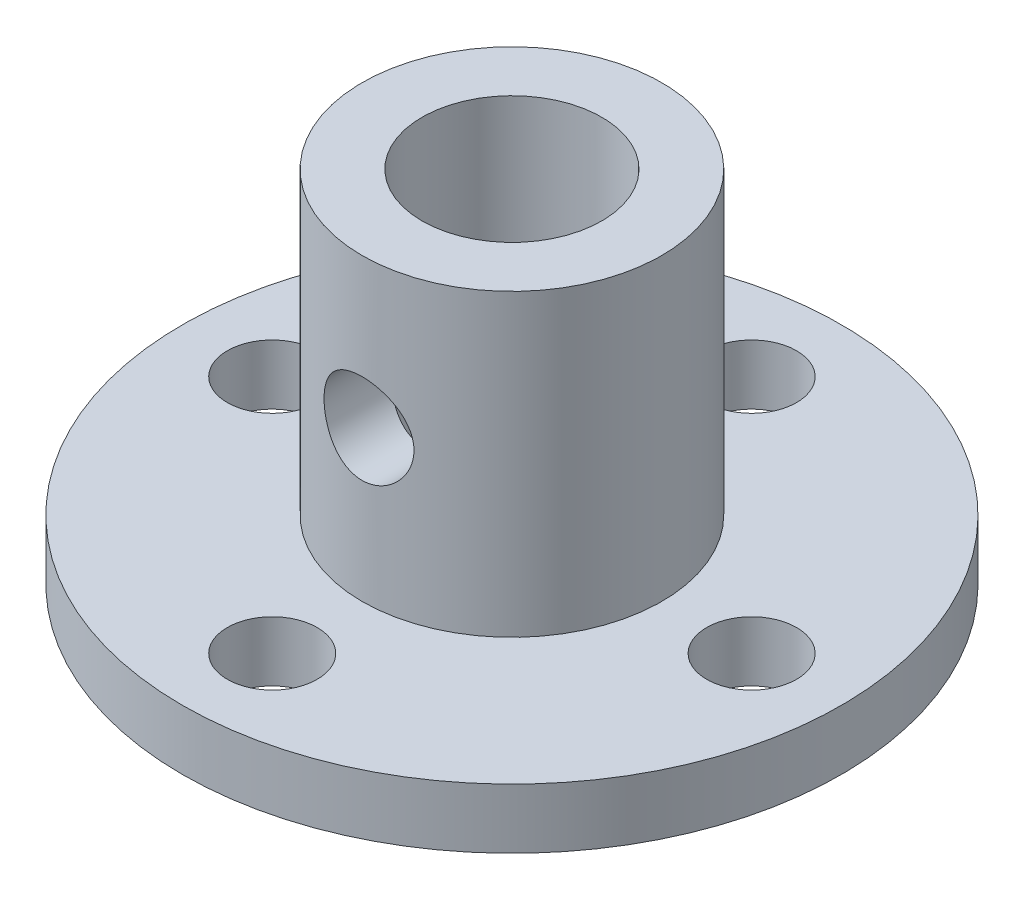
ISO-10303-21;
HEADER;
FILE_DESCRIPTION(('STEP AP214'),'2;1');
FILE_NAME('part.step','',(''),(''),'','','');
FILE_SCHEMA(('AUTOMOTIVE_DESIGN { 1 0 10303 214 1 1 1 1 }'));
ENDSEC;
DATA;
#1=APPLICATION_CONTEXT('core data for automotive mechanical design processes');
#2=APPLICATION_PROTOCOL_DEFINITION('international standard','automotive_design',2000,#1);
#3=PRODUCT_CONTEXT('',#1,'mechanical');
#4=PRODUCT('Part','Part','',(#3));
#5=PRODUCT_RELATED_PRODUCT_CATEGORY('part','',(#4));
#6=PRODUCT_DEFINITION_FORMATION('','',#4);
#7=PRODUCT_DEFINITION_CONTEXT('part definition',#1,'design');
#8=PRODUCT_DEFINITION('design','',#6,#7);
#9=PRODUCT_DEFINITION_SHAPE('','',#8);
#10=(LENGTH_UNIT() NAMED_UNIT(*) SI_UNIT(.MILLI.,.METRE.));
#11=(NAMED_UNIT(*) PLANE_ANGLE_UNIT() SI_UNIT($,.RADIAN.));
#12=(NAMED_UNIT(*) SI_UNIT($,.STERADIAN.) SOLID_ANGLE_UNIT());
#13=UNCERTAINTY_MEASURE_WITH_UNIT(LENGTH_MEASURE(1.E-05),#10,'distance_accuracy_value','');
#14=(GEOMETRIC_REPRESENTATION_CONTEXT(3) GLOBAL_UNCERTAINTY_ASSIGNED_CONTEXT((#13)) GLOBAL_UNIT_ASSIGNED_CONTEXT((#10,
#11,#12)) REPRESENTATION_CONTEXT('',''));
#15=CARTESIAN_POINT('',(0.,0.,0.));
#16=DIRECTION('',(0.,0.,1.));
#17=DIRECTION('',(1.,0.,0.));
#18=AXIS2_PLACEMENT_3D('',#15,#16,#17);
#19=CARTESIAN_POINT('',(0.,12.,0.));
#20=DIRECTION('',(0.,-1.,0.));
#21=DIRECTION('',(0.,0.,-1.));
#22=AXIS2_PLACEMENT_3D('',#19,#20,#21);
#23=CYLINDRICAL_SURFACE('',#22,5.);
#24=CARTESIAN_POINT('',(0.,12.,0.));
#25=DIRECTION('',(0.,1.,0.));
#26=DIRECTION('',(0.,0.,1.));
#27=AXIS2_PLACEMENT_3D('',#24,#25,#26);
#28=CIRCLE('',#27,5.);
#29=CARTESIAN_POINT('',(0.,12.,5.));
#30=VERTEX_POINT('',#29);
#31=EDGE_CURVE('E59',#30,#30,#28,.T.);
#32=ORIENTED_EDGE('',*,*,#31,.F.);
#33=EDGE_LOOP('',(#32));
#34=FACE_BOUND('',#33,.T.);
#35=CARTESIAN_POINT('',(0.,2.,0.));
#36=DIRECTION('',(0.,1.,0.));
#37=DIRECTION('',(0.,0.,1.));
#38=AXIS2_PLACEMENT_3D('',#35,#36,#37);
#39=CIRCLE('',#38,5.);
#40=CARTESIAN_POINT('',(0.,2.,5.));
#41=VERTEX_POINT('',#40);
#42=EDGE_CURVE('E10',#41,#41,#39,.T.);
#43=ORIENTED_EDGE('',*,*,#42,.T.);
#44=EDGE_LOOP('',(#43));
#45=FACE_BOUND('',#44,.T.);
#46=CARTESIAN_POINT('',(0.,8.5,-5.));
#47=CARTESIAN_POINT('',(0.0822886127532999,8.49999900251511,-4.9999992925055));
#48=CARTESIAN_POINT('',(0.164587318351529,8.49320613637603,-4.99794915693954));
#49=CARTESIAN_POINT('',(0.326788125304881,8.4662786457779,-4.98997105593691));
#50=CARTESIAN_POINT('',(0.40668950441142,8.44614004197666,-4.98404193389692));
#51=CARTESIAN_POINT('',(0.561732707754527,8.39325398308974,-4.96895552501836));
#52=CARTESIAN_POINT('',(0.636881364395373,8.36052513038107,-4.95980300250425));
#53=CARTESIAN_POINT('',(0.780624181053132,8.28346390694417,-4.93922109237645));
#54=CARTESIAN_POINT('',(0.84921746746967,8.23912999260458,-4.92779140192067));
#55=CARTESIAN_POINT('',(0.979871797183745,8.13877599252733,-4.90350737192774));
#56=CARTESIAN_POINT('',(1.04171807124434,8.08248337411409,-4.89062383657036));
#57=CARTESIAN_POINT('',(1.15524920923324,7.96039077008982,-4.86505834210442));
#58=CARTESIAN_POINT('',(1.20693236327441,7.89458918787504,-4.85237641724501));
#59=CARTESIAN_POINT('',(1.29980037723708,7.75352924696239,-4.82834113993772));
#60=CARTESIAN_POINT('',(1.34072309022213,7.67809153900926,-4.81702406663875));
#61=CARTESIAN_POINT('',(1.4092139477476,7.52101074576971,-4.79743620394031));
#62=CARTESIAN_POINT('',(1.43678529919973,7.43936915607202,-4.78916468313311));
#63=CARTESIAN_POINT('',(1.47701633682652,7.27460973386954,-4.77690870838434));
#64=CARTESIAN_POINT('',(1.49007196234677,7.19159725613606,-4.77281069324533));
#65=CARTESIAN_POINT('',(1.50213730614672,7.02446684378323,-4.76902789749767));
#66=CARTESIAN_POINT('',(1.50115042761078,6.94034918194091,-4.76934204760571));
#67=CARTESIAN_POINT('',(1.48546977199812,6.77661609139152,-4.77424744067778));
#68=CARTESIAN_POINT('',(1.47127205262685,6.69694774963776,-4.7786838859914));
#69=CARTESIAN_POINT('',(1.43037420427056,6.54118021372654,-4.79108356228624));
#70=CARTESIAN_POINT('',(1.40367284141641,6.46508137262567,-4.79904714132351));
#71=CARTESIAN_POINT('',(1.33816026653682,6.31739965033926,-4.81772733074973));
#72=CARTESIAN_POINT('',(1.29918816934642,6.24589291604474,-4.82848016115952));
#73=CARTESIAN_POINT('',(1.21035222588683,6.11026797798981,-4.85150987000065));
#74=CARTESIAN_POINT('',(1.16048574002588,6.04615157058622,-4.86378711746991));
#75=CARTESIAN_POINT('',(1.04881290765546,5.92431380923798,-4.88911011297937));
#76=CARTESIAN_POINT('',(0.986594907466972,5.86697133597033,-4.90216654310498));
#77=CARTESIAN_POINT('',(0.853263259313967,5.76344601593575,-4.92712244063259));
#78=CARTESIAN_POINT('',(0.782149051860888,5.71726387158557,-4.9390218351841));
#79=CARTESIAN_POINT('',(0.632355038342803,5.63714007753527,-4.9604316006947));
#80=CARTESIAN_POINT('',(0.55362774974795,5.60328248375014,-4.96992543668314));
#81=CARTESIAN_POINT('',(0.391245415603519,5.54940040990037,-4.98533521832222));
#82=CARTESIAN_POINT('',(0.307591751589581,5.52937207146751,-4.99125216186999));
#83=CARTESIAN_POINT('',(0.140952242668331,5.50434782210061,-4.99868364643538));
#84=CARTESIAN_POINT('',(0.0580500976011867,5.49883841419839,-5.0003485041779));
#85=CARTESIAN_POINT('',(-0.107499605823383,5.50156915571208,-4.9995292324176));
#86=CARTESIAN_POINT('',(-0.190147196690781,5.50980746965144,-4.99704565677756));
#87=CARTESIAN_POINT('',(-0.350903605309697,5.5393846111115,-4.98830696987163));
#88=CARTESIAN_POINT('',(-0.429072772614169,5.56042338758087,-4.98213829799417));
#89=CARTESIAN_POINT('',(-0.580754638954522,5.6146432327782,-4.96674347841533));
#90=CARTESIAN_POINT('',(-0.654266777025584,5.64782576103786,-4.95751696321085));
#91=CARTESIAN_POINT('',(-0.796437189461052,5.72625316548113,-4.93669654351325));
#92=CARTESIAN_POINT('',(-0.86494382619967,5.77175934094797,-4.92505280829675));
#93=CARTESIAN_POINT('',(-0.993523307980147,5.87322475405281,-4.90073468764318));
#94=CARTESIAN_POINT('',(-1.05359403235593,5.92918661188767,-4.8880600443108));
#95=CARTESIAN_POINT('',(-1.16585744551027,6.05238730836935,-4.86253171869138));
#96=CARTESIAN_POINT('',(-1.21768481231503,6.11996187577174,-4.84968825033268));
#97=CARTESIAN_POINT('',(-1.30928995072154,6.26312793901353,-4.82576515238463));
#98=CARTESIAN_POINT('',(-1.34906803829472,6.33871922455821,-4.81468547654651));
#99=CARTESIAN_POINT('',(-1.41517347127168,6.49553249125469,-4.79567189615055));
#100=CARTESIAN_POINT('',(-1.4415634693705,6.57672618653659,-4.78772337843827));
#101=CARTESIAN_POINT('',(-1.48021730815114,6.74268796893148,-4.77591594362794));
#102=CARTESIAN_POINT('',(-1.49248598978779,6.82745482078767,-4.772055625083));
#103=CARTESIAN_POINT('',(-1.50221984485059,6.99436151837623,-4.76899972496087));
#104=CARTESIAN_POINT('',(-1.5002805530849,7.07646365101759,-4.76961647442754));
#105=CARTESIAN_POINT('',(-1.48307505444813,7.2391141033728,-4.77499401288294));
#106=CARTESIAN_POINT('',(-1.46780938124716,7.31966248517635,-4.77975463592551));
#107=CARTESIAN_POINT('',(-1.42476888804136,7.47594539914285,-4.79275763670386));
#108=CARTESIAN_POINT('',(-1.39715175507068,7.55172728736169,-4.80095604545965));
#109=CARTESIAN_POINT('',(-1.33031507121129,7.69764243881772,-4.81990278909136));
#110=CARTESIAN_POINT('',(-1.29109329962876,7.76777461764076,-4.83065161194312));
#111=CARTESIAN_POINT('',(-1.20048763805072,7.90316311652711,-4.85397676425833));
#112=CARTESIAN_POINT('',(-1.14871276092994,7.96814876126041,-4.86660540163798));
#113=CARTESIAN_POINT('',(-1.03517434629782,8.08870249830787,-4.89201320450026));
#114=CARTESIAN_POINT('',(-0.9734082171345,8.14426813946776,-4.90479240823905));
#115=CARTESIAN_POINT('',(-0.839465762183248,8.24602341229503,-4.92950936570649));
#116=CARTESIAN_POINT('',(-0.767037885790608,8.29189144685549,-4.94141159765674));
#117=CARTESIAN_POINT('',(-0.61514137398353,8.37073516990402,-4.96260680455813));
#118=CARTESIAN_POINT('',(-0.535676052998955,8.40371688827451,-4.97190099931067));
#119=CARTESIAN_POINT('',(-0.380757712655281,8.45289527565275,-4.98602174969301));
#120=CARTESIAN_POINT('',(-0.305786961954234,8.47051167288325,-4.99122027381068));
#121=CARTESIAN_POINT('',(-0.15388019523078,8.49406352524158,-4.99820944494492));
#122=CARTESIAN_POINT('',(-0.0769445098581397,8.50000093270482,-5.0000006615474));
#123=CARTESIAN_POINT('',(0.,8.5,-5.));
#124=B_SPLINE_CURVE_WITH_KNOTS('',3,(#46,#47,#48,#49,#50,#51,#52,#53,#54,#55,#56,#57,#58,#59,
#60,#61,#62,#63,#64,#65,#66,#67,#68,#69,#70,#71,#72,#73,#74,#75,#76,#77,#78,#79,#80,#81,#82,#83,
#84,#85,#86,#87,#88,#89,#90,#91,#92,#93,#94,#95,#96,#97,#98,#99,#100,#101,#102,#103,#104,#105,
#106,#107,#108,#109,#110,#111,#112,#113,#114,#115,#116,#117,#118,#119,#120,#121,#122,#123),
.UNSPECIFIED.,.T.,.F.,(4,2,2,2,2,2,2,2,2,2,2,2,2,2,2,2,2,2,2,2,2,2,2,2,2,2,2,2,2,2,2,2,2,2,2,2,
2,2,4),(0.,0.24658320361261,0.493239964846,0.739533676300875,0.985860164412702,1.23855602948191,
1.49129437288633,1.74971481004109,2.00807314543224,2.25919689356599,2.51025978319089,
2.75226016697676,2.99428443658001,3.2396242644712,3.48502360158555,3.74067104048167,
3.99633456531072,4.25371046881689,4.51101453528808,4.75908809438545,5.00712853550327,
5.24956746682327,5.49203554593729,5.74011305702908,5.98825282000191,6.24540400322819,
6.50254844252681,6.75847814951252,7.01432009460283,7.25950155466943,7.504673196616,
7.74680040402721,7.98897397553107,8.23996925679931,8.49102974897502,8.74942996156671,
9.00770911595235,9.2383169193046,9.46888616948875),.UNSPECIFIED.);
#125=CARTESIAN_POINT('',(0.,8.5,-5.));
#126=VERTEX_POINT('',#125);
#127=EDGE_CURVE('E111',#126,#126,#124,.T.);
#128=ORIENTED_EDGE('',*,*,#127,.F.);
#129=EDGE_LOOP('',(#128));
#130=FACE_BOUND('',#129,.T.);
#131=CARTESIAN_POINT('',(0.,5.5,5.));
#132=CARTESIAN_POINT('',(0.0822886127532999,5.50000099748489,4.9999992925055));
#133=CARTESIAN_POINT('',(0.164587318351529,5.50679386362397,4.99794915693954));
#134=CARTESIAN_POINT('',(0.326788125304881,5.5337213542221,4.98997105593691));
#135=CARTESIAN_POINT('',(0.40668950441142,5.55385995802334,4.98404193389692));
#136=CARTESIAN_POINT('',(0.561732707754527,5.60674601691026,4.96895552501836));
#137=CARTESIAN_POINT('',(0.636881364395373,5.63947486961894,4.95980300250425));
#138=CARTESIAN_POINT('',(0.780624181053131,5.71653609305584,4.93922109237645));
#139=CARTESIAN_POINT('',(0.849217467469669,5.76087000739542,4.92779140192067));
#140=CARTESIAN_POINT('',(0.979871797183745,5.86122400747267,4.90350737192774));
#141=CARTESIAN_POINT('',(1.04171807124434,5.91751662588591,4.89062383657036));
#142=CARTESIAN_POINT('',(1.15524920923324,6.03960922991018,4.86505834210442));
#143=CARTESIAN_POINT('',(1.20693236327441,6.10541081212496,4.85237641724501));
#144=CARTESIAN_POINT('',(1.29980037723708,6.24647075303761,4.82834113993772));
#145=CARTESIAN_POINT('',(1.34072309022213,6.32190846099074,4.81702406663875));
#146=CARTESIAN_POINT('',(1.4092139477476,6.47898925423029,4.79743620394031));
#147=CARTESIAN_POINT('',(1.43678529919973,6.56063084392798,4.78916468313311));
#148=CARTESIAN_POINT('',(1.47701633682652,6.72539026613046,4.77690870838434));
#149=CARTESIAN_POINT('',(1.49007196234677,6.80840274386394,4.77281069324533));
#150=CARTESIAN_POINT('',(1.50213730614672,6.97553315621677,4.76902789749767));
#151=CARTESIAN_POINT('',(1.50115042761078,7.05965081805909,4.76934204760571));
#152=CARTESIAN_POINT('',(1.48546977199812,7.22338390860848,4.77424744067778));
#153=CARTESIAN_POINT('',(1.47127205262685,7.30305225036224,4.7786838859914));
#154=CARTESIAN_POINT('',(1.43037420427056,7.45881978627346,4.79108356228624));
#155=CARTESIAN_POINT('',(1.40367284141641,7.53491862737433,4.79904714132351));
#156=CARTESIAN_POINT('',(1.33816026653682,7.68260034966074,4.81772733074973));
#157=CARTESIAN_POINT('',(1.29918816934642,7.75410708395526,4.82848016115952));
#158=CARTESIAN_POINT('',(1.21035222588683,7.88973202201019,4.85150987000065));
#159=CARTESIAN_POINT('',(1.16048574002588,7.95384842941378,4.86378711746991));
#160=CARTESIAN_POINT('',(1.04881290765546,8.07568619076202,4.88911011297937));
#161=CARTESIAN_POINT('',(0.986594907466972,8.13302866402967,4.90216654310498));
#162=CARTESIAN_POINT('',(0.853263259313967,8.23655398406425,4.92712244063259));
#163=CARTESIAN_POINT('',(0.782149051860888,8.28273612841443,4.9390218351841));
#164=CARTESIAN_POINT('',(0.632355038342803,8.36285992246473,4.9604316006947));
#165=CARTESIAN_POINT('',(0.55362774974795,8.39671751624986,4.96992543668314));
#166=CARTESIAN_POINT('',(0.391245415603519,8.45059959009963,4.98533521832222));
#167=CARTESIAN_POINT('',(0.307591751589581,8.47062792853249,4.99125216186999));
#168=CARTESIAN_POINT('',(0.140952242668331,8.49565217789939,4.99868364643538));
#169=CARTESIAN_POINT('',(0.0580500976011867,8.50116158580161,5.0003485041779));
#170=CARTESIAN_POINT('',(-0.107499605823383,8.49843084428792,4.9995292324176));
#171=CARTESIAN_POINT('',(-0.190147196690781,8.49019253034856,4.99704565677756));
#172=CARTESIAN_POINT('',(-0.350903605309697,8.4606153888885,4.98830696987163));
#173=CARTESIAN_POINT('',(-0.429072772614169,8.43957661241913,4.98213829799417));
#174=CARTESIAN_POINT('',(-0.580754638954522,8.3853567672218,4.96674347841533));
#175=CARTESIAN_POINT('',(-0.654266777025583,8.35217423896214,4.95751696321085));
#176=CARTESIAN_POINT('',(-0.796437189461052,8.27374683451887,4.93669654351325));
#177=CARTESIAN_POINT('',(-0.86494382619967,8.22824065905203,4.92505280829675));
#178=CARTESIAN_POINT('',(-0.993523307980147,8.12677524594719,4.90073468764318));
#179=CARTESIAN_POINT('',(-1.05359403235593,8.07081338811233,4.8880600443108));
#180=CARTESIAN_POINT('',(-1.16585744551027,7.94761269163066,4.86253171869138));
#181=CARTESIAN_POINT('',(-1.21768481231504,7.88003812422826,4.84968825033268));
#182=CARTESIAN_POINT('',(-1.30928995072154,7.73687206098647,4.82576515238463));
#183=CARTESIAN_POINT('',(-1.34906803829472,7.66128077544179,4.81468547654651));
#184=CARTESIAN_POINT('',(-1.41517347127168,7.50446750874531,4.79567189615055));
#185=CARTESIAN_POINT('',(-1.4415634693705,7.42327381346341,4.78772337843827));
#186=CARTESIAN_POINT('',(-1.48021730815114,7.25731203106852,4.77591594362794));
#187=CARTESIAN_POINT('',(-1.49248598978779,7.17254517921233,4.772055625083));
#188=CARTESIAN_POINT('',(-1.50221984485059,7.00563848162377,4.76899972496087));
#189=CARTESIAN_POINT('',(-1.5002805530849,6.92353634898241,4.76961647442754));
#190=CARTESIAN_POINT('',(-1.48307505444813,6.7608858966272,4.77499401288294));
#191=CARTESIAN_POINT('',(-1.46780938124716,6.68033751482365,4.77975463592551));
#192=CARTESIAN_POINT('',(-1.42476888804136,6.52405460085715,4.79275763670386));
#193=CARTESIAN_POINT('',(-1.39715175507068,6.44827271263831,4.80095604545965));
#194=CARTESIAN_POINT('',(-1.33031507121129,6.30235756118228,4.81990278909136));
#195=CARTESIAN_POINT('',(-1.29109329962876,6.23222538235924,4.83065161194312));
#196=CARTESIAN_POINT('',(-1.20048763805072,6.09683688347289,4.85397676425833));
#197=CARTESIAN_POINT('',(-1.14871276092994,6.03185123873959,4.86660540163798));
#198=CARTESIAN_POINT('',(-1.03517434629782,5.91129750169214,4.89201320450026));
#199=CARTESIAN_POINT('',(-0.973408217134501,5.85573186053224,4.90479240823905));
#200=CARTESIAN_POINT('',(-0.839465762183248,5.75397658770497,4.92950936570649));
#201=CARTESIAN_POINT('',(-0.767037885790608,5.70810855314451,4.94141159765674));
#202=CARTESIAN_POINT('',(-0.615141373983529,5.62926483009598,4.96260680455813));
#203=CARTESIAN_POINT('',(-0.535676052998955,5.59628311172549,4.97190099931067));
#204=CARTESIAN_POINT('',(-0.380757712655281,5.54710472434725,4.98602174969301));
#205=CARTESIAN_POINT('',(-0.305786961954234,5.52948832711675,4.99122027381068));
#206=CARTESIAN_POINT('',(-0.153880195230779,5.50593647475842,4.99820944494492));
#207=CARTESIAN_POINT('',(-0.0769445098581396,5.49999906729518,5.0000006615474));
#208=CARTESIAN_POINT('',(0.,5.5,5.));
#209=B_SPLINE_CURVE_WITH_KNOTS('',3,(#131,#132,#133,#134,#135,#136,#137,#138,#139,#140,#141,
#142,#143,#144,#145,#146,#147,#148,#149,#150,#151,#152,#153,#154,#155,#156,#157,#158,#159,#160,
#161,#162,#163,#164,#165,#166,#167,#168,#169,#170,#171,#172,#173,#174,#175,#176,#177,#178,#179,
#180,#181,#182,#183,#184,#185,#186,#187,#188,#189,#190,#191,#192,#193,#194,#195,#196,#197,#198,
#199,#200,#201,#202,#203,#204,#205,#206,#207,#208),.UNSPECIFIED.,.T.,.F.,(4,2,2,2,2,2,2,2,2,2,2,
2,2,2,2,2,2,2,2,2,2,2,2,2,2,2,2,2,2,2,2,2,2,2,2,2,2,2,4),(0.,0.24658320361261,0.493239964845999,
0.739533676300874,0.985860164412702,1.23855602948191,1.49129437288633,1.74971481004109,
2.00807314543224,2.25919689356599,2.51025978319089,2.75226016697676,2.99428443658001,
3.2396242644712,3.48502360158555,3.74067104048167,3.99633456531071,4.25371046881689,
4.51101453528808,4.75908809438545,5.00712853550327,5.24956746682327,5.49203554593729,
5.74011305702908,5.98825282000191,6.24540400322818,6.5025484425268,6.75847814951252,
7.01432009460283,7.25950155466943,7.504673196616,7.74680040402721,7.98897397553107,
8.23996925679931,8.49102974897502,8.74942996156671,9.00770911595235,9.23831691930459,
9.46888616948874),.UNSPECIFIED.);
#210=CARTESIAN_POINT('',(0.,5.5,5.));
#211=VERTEX_POINT('',#210);
#212=EDGE_CURVE('E105',#211,#211,#209,.T.);
#213=ORIENTED_EDGE('',*,*,#212,.F.);
#214=EDGE_LOOP('',(#213));
#215=FACE_BOUND('',#214,.T.);
#216=ADVANCED_FACE('F37',(#34,#45,#130,#215),#23,.T.);
#217=CARTESIAN_POINT('',(0.,0.,0.));
#218=DIRECTION('',(0.,1.,0.));
#219=DIRECTION('',(0.,0.,1.));
#220=AXIS2_PLACEMENT_3D('',#217,#218,#219);
#221=CYLINDRICAL_SURFACE('',#220,3.);
#222=CARTESIAN_POINT('',(0.,0.,0.));
#223=DIRECTION('',(0.,1.,0.));
#224=DIRECTION('',(0.,0.,1.));
#225=AXIS2_PLACEMENT_3D('',#222,#223,#224);
#226=CIRCLE('',#225,3.);
#227=CARTESIAN_POINT('',(0.,0.,3.));
#228=VERTEX_POINT('',#227);
#229=EDGE_CURVE('E148',#228,#228,#226,.T.);
#230=ORIENTED_EDGE('',*,*,#229,.F.);
#231=EDGE_LOOP('',(#230));
#232=FACE_BOUND('',#231,.T.);
#233=CARTESIAN_POINT('',(0.,12.,0.));
#234=DIRECTION('',(0.,1.,0.));
#235=DIRECTION('',(0.,0.,1.));
#236=AXIS2_PLACEMENT_3D('',#233,#234,#235);
#237=CIRCLE('',#236,3.);
#238=CARTESIAN_POINT('',(0.,12.,3.));
#239=VERTEX_POINT('',#238);
#240=EDGE_CURVE('E173',#239,#239,#237,.T.);
#241=ORIENTED_EDGE('',*,*,#240,.T.);
#242=EDGE_LOOP('',(#241));
#243=FACE_BOUND('',#242,.T.);
#244=CARTESIAN_POINT('',(-1.5,7.,-2.59807621135332));
#245=CARTESIAN_POINT('',(-1.4999945446118,6.92183828770712,-2.59808302092689));
#246=CARTESIAN_POINT('',(-1.49384995609983,6.84357788271243,-2.60165701781635));
#247=CARTESIAN_POINT('',(-1.46958481484708,6.68945910298427,-2.61543549678079));
#248=CARTESIAN_POINT('',(-1.45143909683127,6.61360612743489,-2.62565391083339));
#249=CARTESIAN_POINT('',(-1.40414992304972,6.46682250348409,-2.65124019908098));
#250=CARTESIAN_POINT('',(-1.3750649287406,6.39586802128962,-2.66658065209878));
#251=CARTESIAN_POINT('',(-1.30690128806456,6.25986369700492,-2.70063997225287));
#252=CARTESIAN_POINT('',(-1.26782210105366,6.19481417460631,-2.71935902214097));
#253=CARTESIAN_POINT('',(-1.17699981079632,6.06654140716374,-2.75995303586162));
#254=CARTESIAN_POINT('',(-1.12447805421566,6.00391129648968,-2.7819609545693));
#255=CARTESIAN_POINT('',(-1.0098807114217,5.88788741738994,-2.82557974178559));
#256=CARTESIAN_POINT('',(-0.94780038867344,5.83449825612472,-2.84719040746875));
#257=CARTESIAN_POINT('',(-0.810734345121819,5.73494927327851,-2.88932215429424));
#258=CARTESIAN_POINT('',(-0.735160783518862,5.6895193482107,-2.90967159627259));
#259=CARTESIAN_POINT('',(-0.576235539899255,5.61228872013136,-2.94526134149294));
#260=CARTESIAN_POINT('',(-0.492888807207232,5.58047941579424,-2.96050486775612));
#261=CARTESIAN_POINT('',(-0.327067415888965,5.53374300804835,-2.98320691866356));
#262=CARTESIAN_POINT('',(-0.244952685733226,5.5177757104667,-2.99114220331338));
#263=CARTESIAN_POINT('',(-0.0788559430467717,5.49975082198744,-3.00011375769101));
#264=CARTESIAN_POINT('',(0.00512490876560822,5.49768481480643,-3.00115420176885));
#265=CARTESIAN_POINT('',(0.164748786635625,5.50712001095552,-2.99644472874675));
#266=CARTESIAN_POINT('',(0.240481798765188,5.51745702328183,-2.99127743838241));
#267=CARTESIAN_POINT('',(0.388970657877483,5.54932126585699,-2.97561367889621));
#268=CARTESIAN_POINT('',(0.461726281640889,5.57084933346434,-2.96511681099591));
#269=CARTESIAN_POINT('',(0.603464087354331,5.62462384913472,-2.93957374931482));
#270=CARTESIAN_POINT('',(0.672380135272768,5.6570144697581,-2.92446662293799));
#271=CARTESIAN_POINT('',(0.803965202269994,5.73139512430224,-2.89106468980031));
#272=CARTESIAN_POINT('',(0.866631973257969,5.77338859495353,-2.87276874236226));
#273=CARTESIAN_POINT('',(0.990260491347293,5.87034302729952,-2.83266591598844));
#274=CARTESIAN_POINT('',(1.05050111254404,5.92615454248902,-2.81069063997263));
#275=CARTESIAN_POINT('',(1.16115655544667,6.04688458739527,-2.76681510880217));
#276=CARTESIAN_POINT('',(1.21156381736135,6.11181005841109,-2.74491492398443));
#277=CARTESIAN_POINT('',(1.30425800196332,6.25397228863613,-2.70216234138727));
#278=CARTESIAN_POINT('',(1.34582597246708,6.33172903458132,-2.68146479986061));
#279=CARTESIAN_POINT('',(1.41497866950185,6.4944065070385,-2.64563175417864));
#280=CARTESIAN_POINT('',(1.44257798731633,6.57931964952634,-2.63049045069101));
#281=CARTESIAN_POINT('',(1.48077031653756,6.74682176692419,-2.60916953725552));
#282=CARTESIAN_POINT('',(1.49253768317996,6.82906167856533,-2.60237483772745));
#283=CARTESIAN_POINT('',(1.50227541991714,6.99460201227481,-2.59676879042414));
#284=CARTESIAN_POINT('',(1.50025553597254,7.07790164367968,-2.59795180333967));
#285=CARTESIAN_POINT('',(1.48355406501595,7.23348087786809,-2.60751504810877));
#286=CARTESIAN_POINT('',(1.4702817250687,7.30596917666189,-2.61509381259981));
#287=CARTESIAN_POINT('',(1.43354442694866,7.44755167940644,-2.63541032327012));
#288=CARTESIAN_POINT('',(1.41007616793542,7.51664477611991,-2.64814974007551));
#289=CARTESIAN_POINT('',(1.35247138290733,7.65311699635405,-2.67804333119485));
#290=CARTESIAN_POINT('',(1.31789109553909,7.72026852528033,-2.69537464864595));
#291=CARTESIAN_POINT('',(1.23943059602371,7.84820390730849,-2.73234179245875));
#292=CARTESIAN_POINT('',(1.19554560649832,7.90898446526993,-2.75197880032721));
#293=CARTESIAN_POINT('',(1.09325575079828,8.03046815128532,-2.79431997684504));
#294=CARTESIAN_POINT('',(1.03371790847245,8.09019572607649,-2.81709874731434));
#295=CARTESIAN_POINT('',(0.905106743097432,8.19911835699039,-2.86101352466839));
#296=CARTESIAN_POINT('',(0.836030211983019,8.24830985534581,-2.88214897511564));
#297=CARTESIAN_POINT('',(0.687803043838135,8.33586058892515,-2.92112042536435));
#298=CARTESIAN_POINT('',(0.608434646361169,8.37389967731636,-2.93885462508044));
#299=CARTESIAN_POINT('',(0.443283546961622,8.43570685578609,-2.96825032438951));
#300=CARTESIAN_POINT('',(0.357506552088263,8.45948747704946,-2.9799171551456));
#301=CARTESIAN_POINT('',(0.190469523495626,8.49005284626199,-2.99501262272824));
#302=CARTESIAN_POINT('',(0.109517165775685,8.49819681381417,-2.99909891862287));
#303=CARTESIAN_POINT('',(-0.0526889789268058,8.5012648981816,-3.00063195562697));
#304=CARTESIAN_POINT('',(-0.133942650442631,8.49619364278534,-2.99808102100335));
#305=CARTESIAN_POINT('',(-0.288806988475722,8.47387538980656,-2.98700953256884));
#306=CARTESIAN_POINT('',(-0.362568476716897,8.45745272611349,-2.97889342001985));
#307=CARTESIAN_POINT('',(-0.506168928275427,8.41400950104554,-2.95788140495135));
#308=CARTESIAN_POINT('',(-0.576007327433264,8.38698741985982,-2.94498481699193));
#309=CARTESIAN_POINT('',(-0.713135109367328,8.32190942175104,-2.9148889612218));
#310=CARTESIAN_POINT('',(-0.78018771405007,8.28343101518824,-2.89752925798199));
#311=CARTESIAN_POINT('',(-0.907161962721038,8.19706310371142,-2.86032199712739));
#312=CARTESIAN_POINT('',(-0.967080311122361,8.14916927632649,-2.84047329837541));
#313=CARTESIAN_POINT('',(-1.08437100623534,8.03980429146594,-2.79792915339941));
#314=CARTESIAN_POINT('',(-1.14089652680891,7.97745626878421,-2.77514698517547));
#315=CARTESIAN_POINT('',(-1.24299493109201,7.84382391830535,-2.73094614244278));
#316=CARTESIAN_POINT('',(-1.28855812501509,7.77253176869847,-2.70952868642798));
#317=CARTESIAN_POINT('',(-1.36864661967848,7.62004503012857,-2.66999407957374));
#318=CARTESIAN_POINT('',(-1.40277759894141,7.53860870330689,-2.65200261384405));
#319=CARTESIAN_POINT('',(-1.45631806425962,7.37000139349033,-2.62299234492527));
#320=CARTESIAN_POINT('',(-1.47577678676302,7.28285066663097,-2.61195024221553));
#321=CARTESIAN_POINT('',(-1.49155051179662,7.162291966522,-2.60293908902686));
#322=CARTESIAN_POINT('',(-1.49471415744578,7.12994815840317,-2.60112193507728));
#323=CARTESIAN_POINT('',(-1.49894010763494,7.06507527897663,-2.59868903831625));
#324=CARTESIAN_POINT('',(-1.50000227159981,7.03254619542119,-2.59807337587664));
#325=CARTESIAN_POINT('',(-1.5,7.,-2.59807621135332));
#326=B_SPLINE_CURVE_WITH_KNOTS('',3,(#244,#245,#246,#247,#248,#249,#250,#251,#252,#253,#254,
#255,#256,#257,#258,#259,#260,#261,#262,#263,#264,#265,#266,#267,#268,#269,#270,#271,#272,#273,
#274,#275,#276,#277,#278,#279,#280,#281,#282,#283,#284,#285,#286,#287,#288,#289,#290,#291,#292,
#293,#294,#295,#296,#297,#298,#299,#300,#301,#302,#303,#304,#305,#306,#307,#308,#309,#310,#311,
#312,#313,#314,#315,#316,#317,#318,#319,#320,#321,#322,#323,#324,#325),.UNSPECIFIED.,.T.,.F.,(4,
2,2,2,2,2,2,2,2,2,2,2,2,2,2,2,2,2,2,2,2,2,2,2,2,2,2,2,2,2,2,2,2,2,2,2,2,2,2,2,4),(0.,
0.234348183892072,0.469189339237207,0.702792893878329,0.936409088167725,1.18929346874735,
1.44230356626556,1.71236838358145,1.98226240445837,2.23295227451903,2.4834903552906,
2.71224146226808,2.94100968776183,3.1729430209672,3.40495949025408,3.65890787185336,
3.91305072368878,4.18333262594173,4.45333161317557,4.70193436281318,4.9503613978256,
5.17161275136038,5.39293578654095,5.62450944609131,5.85620229330071,6.1171011537092,
6.37808797467303,6.64596272119449,6.91360169713157,7.1566840558423,7.39968130190957,
7.62666637307239,7.85368400268019,8.09041126079208,8.32724745151079,8.58765362775101,
8.84828914267731,9.11716123557907,9.3851269950414,9.48270202777964,9.58028358741811),.UNSPECIFIED.);
#327=CARTESIAN_POINT('',(-1.5,7.,-2.59807621135332));
#328=VERTEX_POINT('',#327);
#329=EDGE_CURVE('E86',#328,#328,#326,.T.);
#330=ORIENTED_EDGE('',*,*,#329,.F.);
#331=EDGE_LOOP('',(#330));
#332=FACE_BOUND('',#331,.T.);
#333=CARTESIAN_POINT('',(0.,5.5,3.));
#334=CARTESIAN_POINT('',(-0.0788579444268502,5.50000495347579,2.99999570107562));
#335=CARTESIAN_POINT('',(-0.157809899546344,5.50625510968158,2.99685736529635));
#336=CARTESIAN_POINT('',(-0.313380352903344,5.53097932051231,2.98461234055736));
#337=CARTESIAN_POINT('',(-0.389994130070444,5.54947658949672,2.97549431743379));
#338=CARTESIAN_POINT('',(-0.538400317320673,5.59779071292494,2.95224419105063));
#339=CARTESIAN_POINT('',(-0.610210204408719,5.62756357637195,2.93813158766306));
#340=CARTESIAN_POINT('',(-0.747708925209898,5.69735593204748,2.90618664773642));
#341=CARTESIAN_POINT('',(-0.813398240985089,5.7373746163733,2.88835460450288));
#342=CARTESIAN_POINT('',(-0.941261726642864,5.82927587422793,2.84934387387093));
#343=CARTESIAN_POINT('',(-1.00298281668316,5.88172971885946,2.82802798691306));
#344=CARTESIAN_POINT('',(-1.11716916730047,5.99578221887056,2.78489955370115));
#345=CARTESIAN_POINT('',(-1.16962737466015,6.05738777765866,2.76308664313552));
#346=CARTESIAN_POINT('',(-1.26787800067542,6.19372502428507,2.71948426796021));
#347=CARTESIAN_POINT('',(-1.31283800332746,6.26910414751887,2.69782780455198));
#348=CARTESIAN_POINT('',(-1.38925234033604,6.42755100397932,2.65928968158481));
#349=CARTESIAN_POINT('',(-1.4207163224495,6.51061319308412,2.64240461410484));
#350=CARTESIAN_POINT('',(-1.46719866328288,6.67699765813288,2.61686800556713));
#351=CARTESIAN_POINT('',(-1.48308878562066,6.76000667810109,2.6077840737557));
#352=CARTESIAN_POINT('',(-1.50064048996327,6.92796825666922,2.59772834922792));
#353=CARTESIAN_POINT('',(-1.50231613255961,7.01291881130673,2.59674854014932));
#354=CARTESIAN_POINT('',(-1.49203093075844,7.17142903647305,2.60266395385873));
#355=CARTESIAN_POINT('',(-1.48167683930523,7.24513604683457,2.6086314549302));
#356=CARTESIAN_POINT('',(-1.4504097735854,7.38958286405956,2.62614343100775));
#357=CARTESIAN_POINT('',(-1.42949343584648,7.46032171795797,2.63768968247664));
#358=CARTESIAN_POINT('',(-1.37731467057901,7.59884369884849,2.66531214619112));
#359=CARTESIAN_POINT('',(-1.34582260067399,7.66651959817868,2.68148760995998));
#360=CARTESIAN_POINT('',(-1.273562531502,7.79595143888501,2.71655106422106));
#361=CARTESIAN_POINT('',(-1.2327903657187,7.85770470340013,2.73544027170286));
#362=CARTESIAN_POINT('',(-1.13709908236918,7.98178187911484,2.77669736854929));
#363=CARTESIAN_POINT('',(-1.08104168755392,8.04318531036423,2.79920265355119));
#364=CARTESIAN_POINT('',(-0.959333368112061,8.15610312788635,2.84321434950611));
#365=CARTESIAN_POINT('',(-0.893677884861429,8.20761278805082,2.86472027938201));
#366=CARTESIAN_POINT('',(-0.750774758747773,8.30152849154459,2.90552980924446));
#367=CARTESIAN_POINT('',(-0.673130387399113,8.34340070866861,2.92468476243011));
#368=CARTESIAN_POINT('',(-0.510699323233195,8.41314554356451,2.95736821681863));
#369=CARTESIAN_POINT('',(-0.425918364397914,8.44102927752275,2.9709011841533));
#370=CARTESIAN_POINT('',(-0.259149737491053,8.47971310557501,2.98986500612153));
#371=CARTESIAN_POINT('',(-0.177512295822489,8.49173685362017,2.99587407451965));
#372=CARTESIAN_POINT('',(-0.0131693999240276,8.50219709670173,3.00109520188655));
#373=CARTESIAN_POINT('',(0.0695355298048626,8.5006400284592,3.00031048081978));
#374=CARTESIAN_POINT('',(0.22684945797898,8.48468996737188,2.99236788380152));
#375=CARTESIAN_POINT('',(0.301589112074895,8.47130120090501,2.98570868532253));
#376=CARTESIAN_POINT('',(0.447610338452911,8.43364289215732,2.9673325697226));
#377=CARTESIAN_POINT('',(0.51889152853663,8.40937215031976,2.95561509501618));
#378=CARTESIAN_POINT('',(0.658332912674359,8.35000230035045,2.92776377120382));
#379=CARTESIAN_POINT('',(0.726345595508705,8.31461342482557,2.91151322654446));
#380=CARTESIAN_POINT('',(0.855692042548907,8.23433869653015,2.87615961476126));
#381=CARTESIAN_POINT('',(0.917022944664887,8.18944879810691,2.85705533350407));
#382=CARTESIAN_POINT('',(1.03765153393382,8.08635936200393,2.81562332004297));
#383=CARTESIAN_POINT('',(1.09615811672854,8.02728569733228,2.79316327265249));
#384=CARTESIAN_POINT('',(1.20278448167828,7.90011227308341,2.7489358741323));
#385=CARTESIAN_POINT('',(1.25089707856781,7.83200632172812,2.72716901100071));
#386=CARTESIAN_POINT('',(1.33756187171853,7.68453451874054,2.68576788309734));
#387=CARTESIAN_POINT('',(1.37553824370037,7.60478310085828,2.66628794383591));
#388=CARTESIAN_POINT('',(1.43712423890206,7.43873489863755,2.63361108441202));
#389=CARTESIAN_POINT('',(1.46075237380052,7.35244671029967,2.62040607332625));
#390=CARTESIAN_POINT('',(1.49079253120031,7.18463466567294,2.60342251538703));
#391=CARTESIAN_POINT('',(1.49863949460818,7.10344861984714,2.59886075197597));
#392=CARTESIAN_POINT('',(1.5010337315643,6.94082939925321,2.59748031962405));
#393=CARTESIAN_POINT('',(1.49558676993486,6.85939634689321,2.60065829439585));
#394=CARTESIAN_POINT('',(1.47288918838996,6.70677474769985,2.61356793076615));
#395=CARTESIAN_POINT('',(1.45681247151455,6.63534929478289,2.62264641723988));
#396=CARTESIAN_POINT('',(1.41476303733662,6.49628782086345,2.64556524281479));
#397=CARTESIAN_POINT('',(1.38878713673988,6.42865302686195,2.65940711354503));
#398=CARTESIAN_POINT('',(1.32572361795085,6.2940627235202,2.69142795546804));
#399=CARTESIAN_POINT('',(1.28800670672355,6.22745814725646,2.70983583593881));
#400=CARTESIAN_POINT('',(1.20322645745609,6.10108819572811,2.74852997452291));
#401=CARTESIAN_POINT('',(1.15615825686234,6.04132640421833,2.76881720693416));
#402=CARTESIAN_POINT('',(1.04730498999206,5.92278702646799,2.81193484737138));
#403=CARTESIAN_POINT('',(0.984426634495892,5.86501134647456,2.83477474959942));
#404=CARTESIAN_POINT('',(0.849232209349796,5.7606055248471,2.87816628389896));
#405=CARTESIAN_POINT('',(0.776911084957796,5.71398139079514,2.89871667939293));
#406=CARTESIAN_POINT('',(0.623897395174419,5.6331454559319,2.93547014349806));
#407=CARTESIAN_POINT('',(0.543149255665097,5.5990237461453,2.95164144740899));
#408=CARTESIAN_POINT('',(0.376113151707131,5.54528774836389,2.9775201194848));
#409=CARTESIAN_POINT('',(0.289841699383651,5.52563222979143,2.98724585044602));
#410=CARTESIAN_POINT('',(0.168902919736343,5.50915388337139,2.99543192870217));
#411=CARTESIAN_POINT('',(0.135242819162347,5.50572603870049,2.99714048010376));
#412=CARTESIAN_POINT('',(0.0677275977076369,5.50114800172887,2.99942545465223));
#413=CARTESIAN_POINT('',(0.0338724714699424,5.49999787229469,3.00000184655071));
#414=CARTESIAN_POINT('',(0.,5.5,3.));
#415=B_SPLINE_CURVE_WITH_KNOTS('',3,(#333,#334,#335,#336,#337,#338,#339,#340,#341,#342,#343,
#344,#345,#346,#347,#348,#349,#350,#351,#352,#353,#354,#355,#356,#357,#358,#359,#360,#361,#362,
#363,#364,#365,#366,#367,#368,#369,#370,#371,#372,#373,#374,#375,#376,#377,#378,#379,#380,#381,
#382,#383,#384,#385,#386,#387,#388,#389,#390,#391,#392,#393,#394,#395,#396,#397,#398,#399,#400,
#401,#402,#403,#404,#405,#406,#407,#408,#409,#410,#411,#412,#413,#414),.UNSPECIFIED.,.T.,.F.,(4,
2,2,2,2,2,2,2,2,2,2,2,2,2,2,2,2,2,2,2,2,2,2,2,2,2,2,2,2,2,2,2,2,2,2,2,2,2,2,2,4),(0.,
0.236436386130439,0.473322224563796,0.709293233238447,0.945245640872351,1.19547263807713,
1.44588935648105,1.71572589646129,1.98536921847421,2.23887018210344,2.49212035993531,
2.71508568613981,2.93812205888518,3.16635360252731,3.39468781890332,3.65197412000818,
3.90938301898029,4.17874533321661,4.44789325368419,4.69474935707018,4.94148846767214,
5.16910359759183,5.39674382446397,5.63089284041848,5.86514176122509,6.12239415966628,
6.37982382923148,6.64972023242588,6.91926767918176,7.1629396125457,7.40650589797017,
7.62686895373283,7.84730293182526,8.08254685170431,8.31791341715446,8.58187864135757,
8.84598575071868,9.1119602049529,9.37717362931724,9.47872920200875,9.58028757766599),.UNSPECIFIED.);
#416=CARTESIAN_POINT('',(0.,5.5,3.));
#417=VERTEX_POINT('',#416);
#418=EDGE_CURVE('E41',#417,#417,#415,.T.);
#419=ORIENTED_EDGE('',*,*,#418,.F.);
#420=EDGE_LOOP('',(#419));
#421=FACE_BOUND('',#420,.T.);
#422=ADVANCED_FACE('F91',(#232,#243,#332,#421),#221,.F.);
#423=CARTESIAN_POINT('',(0.,2.,0.));
#424=DIRECTION('',(0.,-1.,0.));
#425=DIRECTION('',(0.,0.,-1.));
#426=AXIS2_PLACEMENT_3D('',#423,#424,#425);
#427=CYLINDRICAL_SURFACE('',#426,11.);
#428=CARTESIAN_POINT('',(0.,2.,0.));
#429=DIRECTION('',(0.,1.,0.));
#430=DIRECTION('',(0.,0.,1.));
#431=AXIS2_PLACEMENT_3D('',#428,#429,#430);
#432=CIRCLE('',#431,11.);
#433=CARTESIAN_POINT('',(0.,2.,11.));
#434=VERTEX_POINT('',#433);
#435=EDGE_CURVE('E50',#434,#434,#432,.T.);
#436=ORIENTED_EDGE('',*,*,#435,.F.);
#437=EDGE_LOOP('',(#436));
#438=FACE_BOUND('',#437,.T.);
#439=CARTESIAN_POINT('',(0.,0.,0.));
#440=DIRECTION('',(0.,1.,0.));
#441=DIRECTION('',(0.,0.,1.));
#442=AXIS2_PLACEMENT_3D('',#439,#440,#441);
#443=CIRCLE('',#442,11.);
#444=CARTESIAN_POINT('',(0.,0.,11.));
#445=VERTEX_POINT('',#444);
#446=EDGE_CURVE('E55',#445,#445,#443,.T.);
#447=ORIENTED_EDGE('',*,*,#446,.T.);
#448=EDGE_LOOP('',(#447));
#449=FACE_BOUND('',#448,.T.);
#450=ADVANCED_FACE('F39',(#438,#449),#427,.T.);
#451=CARTESIAN_POINT('',(0.,2.,0.));
#452=DIRECTION('',(0.,1.,0.));
#453=DIRECTION('',(0.,0.,1.));
#454=AXIS2_PLACEMENT_3D('',#451,#452,#453);
#455=PLANE('',#454);
#456=ORIENTED_EDGE('',*,*,#42,.F.);
#457=EDGE_LOOP('',(#456));
#458=FACE_BOUND('',#457,.T.);
#459=CARTESIAN_POINT('',(0.,2.,-8.));
#460=DIRECTION('',(0.,-1.,0.));
#461=DIRECTION('',(0.,0.,-1.));
#462=AXIS2_PLACEMENT_3D('',#459,#460,#461);
#463=CIRCLE('',#462,1.5);
#464=CARTESIAN_POINT('',(0.,2.,-9.5));
#465=VERTEX_POINT('',#464);
#466=EDGE_CURVE('E61',#465,#465,#463,.T.);
#467=ORIENTED_EDGE('',*,*,#466,.T.);
#468=EDGE_LOOP('',(#467));
#469=FACE_BOUND('',#468,.T.);
#470=CARTESIAN_POINT('',(8.,2.,0.));
#471=DIRECTION('',(0.,-1.,0.));
#472=DIRECTION('',(0.,0.,-1.));
#473=AXIS2_PLACEMENT_3D('',#470,#471,#472);
#474=CIRCLE('',#473,1.5);
#475=CARTESIAN_POINT('',(8.,2.,-1.5));
#476=VERTEX_POINT('',#475);
#477=EDGE_CURVE('E67',#476,#476,#474,.T.);
#478=ORIENTED_EDGE('',*,*,#477,.T.);
#479=EDGE_LOOP('',(#478));
#480=FACE_BOUND('',#479,.T.);
#481=CARTESIAN_POINT('',(-8.,2.,0.));
#482=DIRECTION('',(0.,-1.,0.));
#483=DIRECTION('',(0.,0.,-1.));
#484=AXIS2_PLACEMENT_3D('',#481,#482,#483);
#485=CIRCLE('',#484,1.5);
#486=CARTESIAN_POINT('',(-8.,2.,-1.5));
#487=VERTEX_POINT('',#486);
#488=EDGE_CURVE('E73',#487,#487,#485,.T.);
#489=ORIENTED_EDGE('',*,*,#488,.T.);
#490=EDGE_LOOP('',(#489));
#491=FACE_BOUND('',#490,.T.);
#492=CARTESIAN_POINT('',(0.,2.,8.));
#493=DIRECTION('',(0.,-1.,0.));
#494=DIRECTION('',(0.,0.,-1.));
#495=AXIS2_PLACEMENT_3D('',#492,#493,#494);
#496=CIRCLE('',#495,1.5);
#497=CARTESIAN_POINT('',(0.,2.,6.5));
#498=VERTEX_POINT('',#497);
#499=EDGE_CURVE('E79',#498,#498,#496,.T.);
#500=ORIENTED_EDGE('',*,*,#499,.T.);
#501=EDGE_LOOP('',(#500));
#502=FACE_BOUND('',#501,.T.);
#503=ORIENTED_EDGE('',*,*,#435,.T.);
#504=EDGE_LOOP('',(#503));
#505=FACE_BOUND('',#504,.T.);
#506=ADVANCED_FACE('F138',(#458,#469,#480,#491,#502,#505),#455,.T.);
#507=CARTESIAN_POINT('',(0.,0.,0.));
#508=DIRECTION('',(0.,1.,0.));
#509=DIRECTION('',(0.,0.,1.));
#510=AXIS2_PLACEMENT_3D('',#507,#508,#509);
#511=PLANE('',#510);
#512=ORIENTED_EDGE('',*,*,#229,.T.);
#513=EDGE_LOOP('',(#512));
#514=FACE_BOUND('',#513,.T.);
#515=CARTESIAN_POINT('',(0.,0.,-8.));
#516=DIRECTION('',(0.,-1.,0.));
#517=DIRECTION('',(0.,0.,-1.));
#518=AXIS2_PLACEMENT_3D('',#515,#516,#517);
#519=CIRCLE('',#518,1.5);
#520=CARTESIAN_POINT('',(0.,0.,-9.5));
#521=VERTEX_POINT('',#520);
#522=EDGE_CURVE('E64',#521,#521,#519,.T.);
#523=ORIENTED_EDGE('',*,*,#522,.F.);
#524=EDGE_LOOP('',(#523));
#525=FACE_BOUND('',#524,.T.);
#526=CARTESIAN_POINT('',(8.,0.,0.));
#527=DIRECTION('',(0.,-1.,0.));
#528=DIRECTION('',(0.,0.,-1.));
#529=AXIS2_PLACEMENT_3D('',#526,#527,#528);
#530=CIRCLE('',#529,1.5);
#531=CARTESIAN_POINT('',(8.,0.,-1.5));
#532=VERTEX_POINT('',#531);
#533=EDGE_CURVE('E70',#532,#532,#530,.T.);
#534=ORIENTED_EDGE('',*,*,#533,.F.);
#535=EDGE_LOOP('',(#534));
#536=FACE_BOUND('',#535,.T.);
#537=CARTESIAN_POINT('',(-8.,0.,0.));
#538=DIRECTION('',(0.,-1.,0.));
#539=DIRECTION('',(0.,0.,-1.));
#540=AXIS2_PLACEMENT_3D('',#537,#538,#539);
#541=CIRCLE('',#540,1.5);
#542=CARTESIAN_POINT('',(-8.,0.,-1.5));
#543=VERTEX_POINT('',#542);
#544=EDGE_CURVE('E76',#543,#543,#541,.T.);
#545=ORIENTED_EDGE('',*,*,#544,.F.);
#546=EDGE_LOOP('',(#545));
#547=FACE_BOUND('',#546,.T.);
#548=CARTESIAN_POINT('',(0.,0.,8.));
#549=DIRECTION('',(0.,-1.,0.));
#550=DIRECTION('',(0.,0.,-1.));
#551=AXIS2_PLACEMENT_3D('',#548,#549,#550);
#552=CIRCLE('',#551,1.5);
#553=CARTESIAN_POINT('',(0.,0.,6.5));
#554=VERTEX_POINT('',#553);
#555=EDGE_CURVE('E82',#554,#554,#552,.T.);
#556=ORIENTED_EDGE('',*,*,#555,.F.);
#557=EDGE_LOOP('',(#556));
#558=FACE_BOUND('',#557,.T.);
#559=ORIENTED_EDGE('',*,*,#446,.F.);
#560=EDGE_LOOP('',(#559));
#561=FACE_BOUND('',#560,.T.);
#562=ADVANCED_FACE('F136',(#514,#525,#536,#547,#558,#561),#511,.F.);
#563=CARTESIAN_POINT('',(0.,2.,8.));
#564=DIRECTION('',(0.,-1.,0.));
#565=DIRECTION('',(0.,0.,-1.));
#566=AXIS2_PLACEMENT_3D('',#563,#564,#565);
#567=CYLINDRICAL_SURFACE('',#566,1.5);
#568=ORIENTED_EDGE('',*,*,#499,.F.);
#569=EDGE_LOOP('',(#568));
#570=FACE_BOUND('',#569,.T.);
#571=ORIENTED_EDGE('',*,*,#555,.T.);
#572=EDGE_LOOP('',(#571));
#573=FACE_BOUND('',#572,.T.);
#574=ADVANCED_FACE('F132',(#570,#573),#567,.F.);
#575=CARTESIAN_POINT('',(-8.,2.,0.));
#576=DIRECTION('',(0.,-1.,0.));
#577=DIRECTION('',(0.,0.,-1.));
#578=AXIS2_PLACEMENT_3D('',#575,#576,#577);
#579=CYLINDRICAL_SURFACE('',#578,1.5);
#580=ORIENTED_EDGE('',*,*,#488,.F.);
#581=EDGE_LOOP('',(#580));
#582=FACE_BOUND('',#581,.T.);
#583=ORIENTED_EDGE('',*,*,#544,.T.);
#584=EDGE_LOOP('',(#583));
#585=FACE_BOUND('',#584,.T.);
#586=ADVANCED_FACE('F128',(#582,#585),#579,.F.);
#587=CARTESIAN_POINT('',(8.,2.,0.));
#588=DIRECTION('',(0.,-1.,0.));
#589=DIRECTION('',(0.,0.,-1.));
#590=AXIS2_PLACEMENT_3D('',#587,#588,#589);
#591=CYLINDRICAL_SURFACE('',#590,1.5);
#592=ORIENTED_EDGE('',*,*,#477,.F.);
#593=EDGE_LOOP('',(#592));
#594=FACE_BOUND('',#593,.T.);
#595=ORIENTED_EDGE('',*,*,#533,.T.);
#596=EDGE_LOOP('',(#595));
#597=FACE_BOUND('',#596,.T.);
#598=ADVANCED_FACE('F124',(#594,#597),#591,.F.);
#599=CARTESIAN_POINT('',(0.,2.,-8.));
#600=DIRECTION('',(0.,-1.,0.));
#601=DIRECTION('',(0.,0.,-1.));
#602=AXIS2_PLACEMENT_3D('',#599,#600,#601);
#603=CYLINDRICAL_SURFACE('',#602,1.5);
#604=ORIENTED_EDGE('',*,*,#466,.F.);
#605=EDGE_LOOP('',(#604));
#606=FACE_BOUND('',#605,.T.);
#607=ORIENTED_EDGE('',*,*,#522,.T.);
#608=EDGE_LOOP('',(#607));
#609=FACE_BOUND('',#608,.T.);
#610=ADVANCED_FACE('F120',(#606,#609),#603,.F.);
#611=CARTESIAN_POINT('',(0.,12.,0.));
#612=DIRECTION('',(0.,1.,0.));
#613=DIRECTION('',(0.,0.,1.));
#614=AXIS2_PLACEMENT_3D('',#611,#612,#613);
#615=PLANE('',#614);
#616=ORIENTED_EDGE('',*,*,#240,.F.);
#617=EDGE_LOOP('',(#616));
#618=FACE_BOUND('',#617,.T.);
#619=ORIENTED_EDGE('',*,*,#31,.T.);
#620=EDGE_LOOP('',(#619));
#621=FACE_BOUND('',#620,.T.);
#622=ADVANCED_FACE('F98',(#618,#621),#615,.T.);
#623=CARTESIAN_POINT('',(0.,7.,5.));
#624=DIRECTION('',(0.,0.,-1.));
#625=DIRECTION('',(-1.,0.,0.));
#626=AXIS2_PLACEMENT_3D('',#623,#624,#625);
#627=CYLINDRICAL_SURFACE('',#626,1.5);
#628=ORIENTED_EDGE('',*,*,#329,.T.);
#629=EDGE_LOOP('',(#628));
#630=FACE_BOUND('',#629,.T.);
#631=ORIENTED_EDGE('',*,*,#127,.T.);
#632=EDGE_LOOP('',(#631));
#633=FACE_BOUND('',#632,.T.);
#634=ADVANCED_FACE('F94',(#630,#633),#627,.F.);
#635=ORIENTED_EDGE('',*,*,#418,.T.);
#636=EDGE_LOOP('',(#635));
#637=FACE_BOUND('',#636,.T.);
#638=ORIENTED_EDGE('',*,*,#212,.T.);
#639=EDGE_LOOP('',(#638));
#640=FACE_BOUND('',#639,.T.);
#641=ADVANCED_FACE('F97',(#637,#640),#627,.F.);
#642=CLOSED_SHELL('',(#216,#422,#450,#506,#562,#574,#586,#598,#610,#622,#634,#641));
#643=MANIFOLD_SOLID_BREP('B2',#642);
#644=ADVANCED_BREP_SHAPE_REPRESENTATION('',(#18,#643),#14);
#645=SHAPE_DEFINITION_REPRESENTATION(#9,#644);
ENDSEC;
END-ISO-10303-21;
